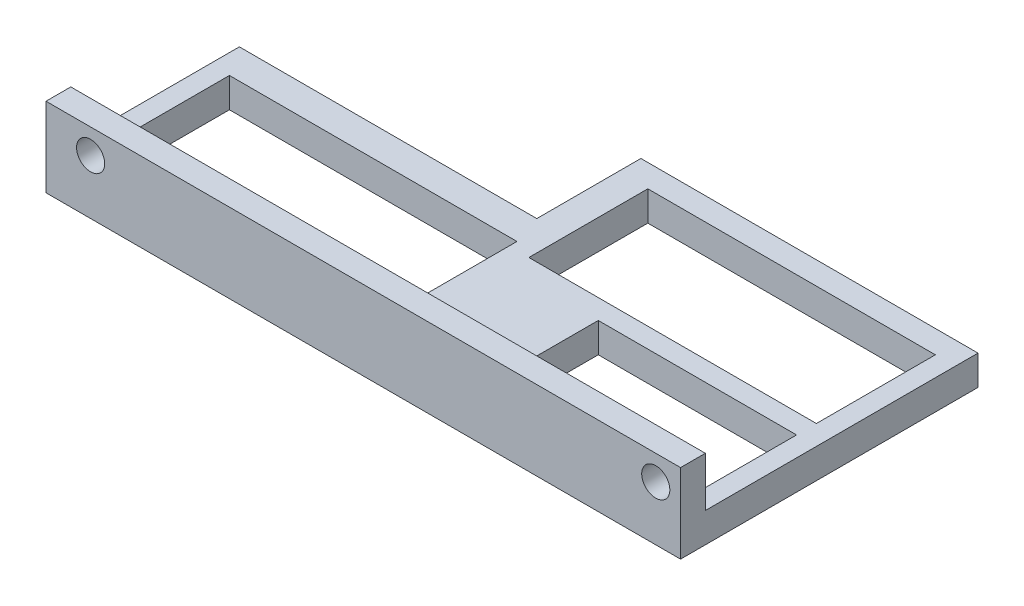
ISO-10303-21;
HEADER;
FILE_DESCRIPTION(('STEP AP214'),'2;1');
FILE_NAME('part.step','',(''),(''),'','','');
FILE_SCHEMA(('AUTOMOTIVE_DESIGN { 1 0 10303 214 1 1 1 1 }'));
ENDSEC;
DATA;
#1=APPLICATION_CONTEXT('core data for automotive mechanical design processes');
#2=APPLICATION_PROTOCOL_DEFINITION('international standard','automotive_design',2000,#1);
#3=PRODUCT_CONTEXT('',#1,'mechanical');
#4=PRODUCT('Part','Part','',(#3));
#5=PRODUCT_RELATED_PRODUCT_CATEGORY('part','',(#4));
#6=PRODUCT_DEFINITION_FORMATION('','',#4);
#7=PRODUCT_DEFINITION_CONTEXT('part definition',#1,'design');
#8=PRODUCT_DEFINITION('design','',#6,#7);
#9=PRODUCT_DEFINITION_SHAPE('','',#8);
#10=(LENGTH_UNIT() NAMED_UNIT(*) SI_UNIT(.MILLI.,.METRE.));
#11=(NAMED_UNIT(*) PLANE_ANGLE_UNIT() SI_UNIT($,.RADIAN.));
#12=(NAMED_UNIT(*) SI_UNIT($,.STERADIAN.) SOLID_ANGLE_UNIT());
#13=UNCERTAINTY_MEASURE_WITH_UNIT(LENGTH_MEASURE(1.E-05),#10,'distance_accuracy_value','');
#14=(GEOMETRIC_REPRESENTATION_CONTEXT(3) GLOBAL_UNCERTAINTY_ASSIGNED_CONTEXT((#13)) GLOBAL_UNIT_ASSIGNED_CONTEXT((#10,
#11,#12)) REPRESENTATION_CONTEXT('',''));
#15=CARTESIAN_POINT('',(0.,0.,0.));
#16=DIRECTION('',(0.,0.,1.));
#17=DIRECTION('',(1.,0.,0.));
#18=AXIS2_PLACEMENT_3D('',#15,#16,#17);
#19=CARTESIAN_POINT('',(0.,3.,0.));
#20=DIRECTION('',(0.,-1.,0.));
#21=DIRECTION('',(0.,0.,-1.));
#22=AXIS2_PLACEMENT_3D('',#19,#20,#21);
#23=PLANE('',#22);
#24=DIRECTION('',(1.,0.,0.));
#25=VECTOR('',#24,1.);
#26=CARTESIAN_POINT('',(1.99999999999999,3.,-4.));
#27=LINE('',#26,#25);
#28=CARTESIAN_POINT('',(1.99999999999999,3.,-4.));
#29=VERTEX_POINT('',#28);
#30=CARTESIAN_POINT('',(31.,3.,-4.));
#31=VERTEX_POINT('',#30);
#32=EDGE_CURVE('E297',#29,#31,#27,.T.);
#33=ORIENTED_EDGE('',*,*,#32,.F.);
#34=DIRECTION('',(0.,0.,1.));
#35=VECTOR('',#34,1.);
#36=CARTESIAN_POINT('',(1.99999999999998,3.,-16.5));
#37=LINE('',#36,#35);
#38=CARTESIAN_POINT('',(1.99999999999998,3.,-16.5));
#39=VERTEX_POINT('',#38);
#40=EDGE_CURVE('E295',#39,#29,#37,.T.);
#41=ORIENTED_EDGE('',*,*,#40,.F.);
#42=DIRECTION('',(-1.,0.,0.));
#43=VECTOR('',#42,1.);
#44=CARTESIAN_POINT('',(1.99999999999998,3.,-16.5));
#45=LINE('',#44,#43);
#46=CARTESIAN_POINT('',(31.,3.,-16.5));
#47=VERTEX_POINT('',#46);
#48=EDGE_CURVE('E303',#47,#39,#45,.T.);
#49=ORIENTED_EDGE('',*,*,#48,.F.);
#50=DIRECTION('',(0.,0.,-1.));
#51=VECTOR('',#50,1.);
#52=CARTESIAN_POINT('',(31.,3.,-4.));
#53=LINE('',#52,#51);
#54=EDGE_CURVE('E300',#31,#47,#53,.T.);
#55=ORIENTED_EDGE('',*,*,#54,.F.);
#56=EDGE_LOOP('',(#33,#41,#49,#55));
#57=FACE_BOUND('',#56,.T.);
#58=DIRECTION('',(1.,0.,0.));
#59=VECTOR('',#58,1.);
#60=CARTESIAN_POINT('',(33.,3.,-15.7));
#61=LINE('',#60,#59);
#62=CARTESIAN_POINT('',(33.,3.,-15.7));
#63=VERTEX_POINT('',#62);
#64=CARTESIAN_POINT('',(62.,3.,-15.7));
#65=VERTEX_POINT('',#64);
#66=EDGE_CURVE('E219',#63,#65,#61,.T.);
#67=ORIENTED_EDGE('',*,*,#66,.F.);
#68=DIRECTION('',(0.,0.,1.));
#69=VECTOR('',#68,1.);
#70=CARTESIAN_POINT('',(33.,3.,-15.7));
#71=LINE('',#70,#69);
#72=CARTESIAN_POINT('',(33.,3.,-27.7));
#73=VERTEX_POINT('',#72);
#74=EDGE_CURVE('E217',#73,#63,#71,.T.);
#75=ORIENTED_EDGE('',*,*,#74,.F.);
#76=DIRECTION('',(-1.,0.,0.));
#77=VECTOR('',#76,1.);
#78=CARTESIAN_POINT('',(33.,3.,-27.7));
#79=LINE('',#78,#77);
#80=CARTESIAN_POINT('',(62.,3.,-27.7));
#81=VERTEX_POINT('',#80);
#82=EDGE_CURVE('E225',#81,#73,#79,.T.);
#83=ORIENTED_EDGE('',*,*,#82,.F.);
#84=DIRECTION('',(0.,0.,-1.));
#85=VECTOR('',#84,1.);
#86=CARTESIAN_POINT('',(62.,3.,-27.7));
#87=LINE('',#86,#85);
#88=EDGE_CURVE('E222',#65,#81,#87,.T.);
#89=ORIENTED_EDGE('',*,*,#88,.F.);
#90=EDGE_LOOP('',(#67,#75,#83,#89));
#91=FACE_BOUND('',#90,.T.);
#92=DIRECTION('',(1.,0.,0.));
#93=VECTOR('',#92,1.);
#94=CARTESIAN_POINT('',(42.,3.,-4.));
#95=LINE('',#94,#93);
#96=CARTESIAN_POINT('',(42.,3.,-4.));
#97=VERTEX_POINT('',#96);
#98=CARTESIAN_POINT('',(62.,3.,-4.));
#99=VERTEX_POINT('',#98);
#100=EDGE_CURVE('E252',#97,#99,#95,.T.);
#101=ORIENTED_EDGE('',*,*,#100,.F.);
#102=DIRECTION('',(0.,0.,1.));
#103=VECTOR('',#102,1.);
#104=CARTESIAN_POINT('',(42.,3.,-13.7));
#105=LINE('',#104,#103);
#106=CARTESIAN_POINT('',(42.,3.,-13.7));
#107=VERTEX_POINT('',#106);
#108=EDGE_CURVE('E56',#107,#97,#105,.T.);
#109=ORIENTED_EDGE('',*,*,#108,.F.);
#110=DIRECTION('',(-1.,0.,0.));
#111=VECTOR('',#110,1.);
#112=CARTESIAN_POINT('',(42.,3.,-13.7));
#113=LINE('',#112,#111);
#114=CARTESIAN_POINT('',(62.,3.,-13.7));
#115=VERTEX_POINT('',#114);
#116=EDGE_CURVE('E258',#115,#107,#113,.T.);
#117=ORIENTED_EDGE('',*,*,#116,.F.);
#118=DIRECTION('',(0.,0.,-1.));
#119=VECTOR('',#118,1.);
#120=CARTESIAN_POINT('',(62.,3.,-13.7));
#121=LINE('',#120,#119);
#122=EDGE_CURVE('E255',#99,#115,#121,.T.);
#123=ORIENTED_EDGE('',*,*,#122,.F.);
#124=EDGE_LOOP('',(#101,#109,#117,#123));
#125=FACE_BOUND('',#124,.T.);
#126=DIRECTION('',(-1.,0.,0.));
#127=VECTOR('',#126,1.);
#128=CARTESIAN_POINT('',(0.,3.,-2.5));
#129=LINE('',#128,#127);
#130=CARTESIAN_POINT('',(64.,3.,-2.5));
#131=VERTEX_POINT('',#130);
#132=CARTESIAN_POINT('',(0.,3.,-2.5));
#133=VERTEX_POINT('',#132);
#134=EDGE_CURVE('E48',#131,#133,#129,.T.);
#135=ORIENTED_EDGE('',*,*,#134,.F.);
#136=DIRECTION('',(0.,0.,-1.));
#137=VECTOR('',#136,1.);
#138=CARTESIAN_POINT('',(64.,3.,0.));
#139=LINE('',#138,#137);
#140=CARTESIAN_POINT('',(64.,3.,-30.));
#141=VERTEX_POINT('',#140);
#142=EDGE_CURVE('E320',#131,#141,#139,.T.);
#143=ORIENTED_EDGE('',*,*,#142,.T.);
#144=DIRECTION('',(-1.,0.,0.));
#145=VECTOR('',#144,1.);
#146=CARTESIAN_POINT('',(0.,3.,-30.));
#147=LINE('',#146,#145);
#148=CARTESIAN_POINT('',(30.,3.,-30.));
#149=VERTEX_POINT('',#148);
#150=EDGE_CURVE('E323',#141,#149,#147,.T.);
#151=ORIENTED_EDGE('',*,*,#150,.T.);
#152=DIRECTION('',(0.,0.,-1.));
#153=VECTOR('',#152,1.);
#154=CARTESIAN_POINT('',(30.,3.,-30.));
#155=LINE('',#154,#153);
#156=CARTESIAN_POINT('',(30.,3.,-19.5));
#157=VERTEX_POINT('',#156);
#158=EDGE_CURVE('E276',#157,#149,#155,.T.);
#159=ORIENTED_EDGE('',*,*,#158,.F.);
#160=DIRECTION('',(1.,0.,0.));
#161=VECTOR('',#160,1.);
#162=CARTESIAN_POINT('',(0.,3.,-19.5));
#163=LINE('',#162,#161);
#164=CARTESIAN_POINT('',(0.,3.,-19.5));
#165=VERTEX_POINT('',#164);
#166=EDGE_CURVE('E273',#165,#157,#163,.T.);
#167=ORIENTED_EDGE('',*,*,#166,.F.);
#168=DIRECTION('',(0.,0.,1.));
#169=VECTOR('',#168,1.);
#170=CARTESIAN_POINT('',(0.,3.,0.));
#171=LINE('',#170,#169);
#172=EDGE_CURVE('E318',#165,#133,#171,.T.);
#173=ORIENTED_EDGE('',*,*,#172,.T.);
#174=EDGE_LOOP('',(#135,#143,#151,#159,#167,#173));
#175=FACE_BOUND('',#174,.T.);
#176=ADVANCED_FACE('F33',(#57,#91,#125,#175),#23,.F.);
#177=CARTESIAN_POINT('',(0.,3.,0.));
#178=DIRECTION('',(1.,0.,0.));
#179=DIRECTION('',(0.,0.,-1.));
#180=AXIS2_PLACEMENT_3D('',#177,#178,#179);
#181=PLANE('',#180);
#182=ORIENTED_EDGE('',*,*,#172,.F.);
#183=DIRECTION('',(0.,1.,0.));
#184=VECTOR('',#183,1.);
#185=CARTESIAN_POINT('',(0.,-0.00100000000000013,-19.5));
#186=LINE('',#185,#184);
#187=CARTESIAN_POINT('',(0.,0.,-19.5));
#188=VERTEX_POINT('',#187);
#189=EDGE_CURVE('E278',#188,#165,#186,.T.);
#190=ORIENTED_EDGE('',*,*,#189,.F.);
#191=DIRECTION('',(0.,0.,1.));
#192=VECTOR('',#191,1.);
#193=CARTESIAN_POINT('',(0.,0.,0.));
#194=LINE('',#193,#192);
#195=CARTESIAN_POINT('',(0.,0.,0.));
#196=VERTEX_POINT('',#195);
#197=EDGE_CURVE('E177',#188,#196,#194,.T.);
#198=ORIENTED_EDGE('',*,*,#197,.T.);
#199=DIRECTION('',(0.,-1.,0.));
#200=VECTOR('',#199,1.);
#201=CARTESIAN_POINT('',(0.,3.,0.));
#202=LINE('',#201,#200);
#203=CARTESIAN_POINT('',(0.,8.,0.));
#204=VERTEX_POINT('',#203);
#205=EDGE_CURVE('E11',#204,#196,#202,.T.);
#206=ORIENTED_EDGE('',*,*,#205,.F.);
#207=DIRECTION('',(0.,0.,1.));
#208=VECTOR('',#207,1.);
#209=CARTESIAN_POINT('',(0.,8.,-2.5));
#210=LINE('',#209,#208);
#211=CARTESIAN_POINT('',(0.,8.,-2.5));
#212=VERTEX_POINT('',#211);
#213=EDGE_CURVE('E174',#212,#204,#210,.T.);
#214=ORIENTED_EDGE('',*,*,#213,.F.);
#215=DIRECTION('',(0.,-1.,0.));
#216=VECTOR('',#215,1.);
#217=CARTESIAN_POINT('',(0.,8.,-2.5));
#218=LINE('',#217,#216);
#219=EDGE_CURVE('E200',#212,#133,#218,.T.);
#220=ORIENTED_EDGE('',*,*,#219,.T.);
#221=EDGE_LOOP('',(#182,#190,#198,#206,#214,#220));
#222=FACE_BOUND('',#221,.T.);
#223=ADVANCED_FACE('F35',(#222),#181,.F.);
#224=CARTESIAN_POINT('',(0.,3.,0.));
#225=DIRECTION('',(0.,0.,-1.));
#226=DIRECTION('',(-1.,0.,0.));
#227=AXIS2_PLACEMENT_3D('',#224,#225,#226);
#228=PLANE('',#227);
#229=CARTESIAN_POINT('',(61.5,5.5,0.));
#230=DIRECTION('',(0.,0.,1.));
#231=DIRECTION('',(1.,0.,0.));
#232=AXIS2_PLACEMENT_3D('',#229,#230,#231);
#233=CIRCLE('',#232,1.41917659701633);
#234=CARTESIAN_POINT('',(62.9191765970163,5.5,0.));
#235=VERTEX_POINT('',#234);
#236=EDGE_CURVE('E392',#235,#235,#233,.T.);
#237=ORIENTED_EDGE('',*,*,#236,.F.);
#238=EDGE_LOOP('',(#237));
#239=FACE_BOUND('',#238,.T.);
#240=CARTESIAN_POINT('',(4.49999999999999,5.5,0.));
#241=DIRECTION('',(0.,0.,1.));
#242=DIRECTION('',(1.,0.,0.));
#243=AXIS2_PLACEMENT_3D('',#240,#241,#242);
#244=CIRCLE('',#243,1.41917659701634);
#245=CARTESIAN_POINT('',(5.91917659701633,5.5,0.));
#246=VERTEX_POINT('',#245);
#247=EDGE_CURVE('E395',#246,#246,#244,.T.);
#248=ORIENTED_EDGE('',*,*,#247,.F.);
#249=EDGE_LOOP('',(#248));
#250=FACE_BOUND('',#249,.T.);
#251=DIRECTION('',(1.,0.,0.));
#252=VECTOR('',#251,1.);
#253=CARTESIAN_POINT('',(0.,0.,0.));
#254=LINE('',#253,#252);
#255=CARTESIAN_POINT('',(64.,0.,0.));
#256=VERTEX_POINT('',#255);
#257=EDGE_CURVE('E328',#196,#256,#254,.T.);
#258=ORIENTED_EDGE('',*,*,#257,.T.);
#259=DIRECTION('',(0.,-1.,0.));
#260=VECTOR('',#259,1.);
#261=CARTESIAN_POINT('',(64.,3.,0.));
#262=LINE('',#261,#260);
#263=CARTESIAN_POINT('',(64.,8.,0.));
#264=VERTEX_POINT('',#263);
#265=EDGE_CURVE('E41',#264,#256,#262,.T.);
#266=ORIENTED_EDGE('',*,*,#265,.F.);
#267=DIRECTION('',(1.,0.,0.));
#268=VECTOR('',#267,1.);
#269=CARTESIAN_POINT('',(0.,8.,0.));
#270=LINE('',#269,#268);
#271=EDGE_CURVE('E181',#204,#264,#270,.T.);
#272=ORIENTED_EDGE('',*,*,#271,.F.);
#273=ORIENTED_EDGE('',*,*,#205,.T.);
#274=EDGE_LOOP('',(#258,#266,#272,#273));
#275=FACE_BOUND('',#274,.T.);
#276=ADVANCED_FACE('F182',(#239,#250,#275),#228,.F.);
#277=CARTESIAN_POINT('',(64.,3.,0.));
#278=DIRECTION('',(-1.,0.,0.));
#279=DIRECTION('',(0.,0.,1.));
#280=AXIS2_PLACEMENT_3D('',#277,#278,#279);
#281=PLANE('',#280);
#282=DIRECTION('',(0.,0.,-1.));
#283=VECTOR('',#282,1.);
#284=CARTESIAN_POINT('',(64.,0.,0.));
#285=LINE('',#284,#283);
#286=CARTESIAN_POINT('',(64.,0.,-30.));
#287=VERTEX_POINT('',#286);
#288=EDGE_CURVE('E330',#256,#287,#285,.T.);
#289=ORIENTED_EDGE('',*,*,#288,.T.);
#290=DIRECTION('',(0.,-1.,0.));
#291=VECTOR('',#290,1.);
#292=CARTESIAN_POINT('',(64.,3.,-30.));
#293=LINE('',#292,#291);
#294=EDGE_CURVE('E326',#141,#287,#293,.T.);
#295=ORIENTED_EDGE('',*,*,#294,.F.);
#296=ORIENTED_EDGE('',*,*,#142,.F.);
#297=DIRECTION('',(0.,-1.,0.));
#298=VECTOR('',#297,1.);
#299=CARTESIAN_POINT('',(64.,8.,-2.5));
#300=LINE('',#299,#298);
#301=CARTESIAN_POINT('',(64.,8.,-2.5));
#302=VERTEX_POINT('',#301);
#303=EDGE_CURVE('E203',#302,#131,#300,.T.);
#304=ORIENTED_EDGE('',*,*,#303,.F.);
#305=DIRECTION('',(0.,0.,-1.));
#306=VECTOR('',#305,1.);
#307=CARTESIAN_POINT('',(64.,8.,-2.5));
#308=LINE('',#307,#306);
#309=EDGE_CURVE('E186',#264,#302,#308,.T.);
#310=ORIENTED_EDGE('',*,*,#309,.F.);
#311=ORIENTED_EDGE('',*,*,#265,.T.);
#312=EDGE_LOOP('',(#289,#295,#296,#304,#310,#311));
#313=FACE_BOUND('',#312,.T.);
#314=ADVANCED_FACE('F337',(#313),#281,.F.);
#315=CARTESIAN_POINT('',(0.,3.,-30.));
#316=DIRECTION('',(0.,0.,1.));
#317=DIRECTION('',(1.,0.,0.));
#318=AXIS2_PLACEMENT_3D('',#315,#316,#317);
#319=PLANE('',#318);
#320=DIRECTION('',(-1.,0.,0.));
#321=VECTOR('',#320,1.);
#322=CARTESIAN_POINT('',(0.,0.,-30.));
#323=LINE('',#322,#321);
#324=CARTESIAN_POINT('',(30.,0.,-30.));
#325=VERTEX_POINT('',#324);
#326=EDGE_CURVE('E321',#287,#325,#323,.T.);
#327=ORIENTED_EDGE('',*,*,#326,.T.);
#328=DIRECTION('',(0.,1.,0.));
#329=VECTOR('',#328,1.);
#330=CARTESIAN_POINT('',(30.,-0.00100000000000013,-30.));
#331=LINE('',#330,#329);
#332=EDGE_CURVE('E279',#325,#149,#331,.T.);
#333=ORIENTED_EDGE('',*,*,#332,.T.);
#334=ORIENTED_EDGE('',*,*,#150,.F.);
#335=ORIENTED_EDGE('',*,*,#294,.T.);
#336=EDGE_LOOP('',(#327,#333,#334,#335));
#337=FACE_BOUND('',#336,.T.);
#338=ADVANCED_FACE('F346',(#337),#319,.F.);
#339=CARTESIAN_POINT('',(0.,0.,0.));
#340=DIRECTION('',(0.,-1.,0.));
#341=DIRECTION('',(0.,0.,-1.));
#342=AXIS2_PLACEMENT_3D('',#339,#340,#341);
#343=PLANE('',#342);
#344=DIRECTION('',(0.,0.,-1.));
#345=VECTOR('',#344,1.);
#346=CARTESIAN_POINT('',(30.,0.,-30.));
#347=LINE('',#346,#345);
#348=CARTESIAN_POINT('',(30.,0.,-19.5));
#349=VERTEX_POINT('',#348);
#350=EDGE_CURVE('E206',#349,#325,#347,.T.);
#351=ORIENTED_EDGE('',*,*,#350,.T.);
#352=ORIENTED_EDGE('',*,*,#326,.F.);
#353=ORIENTED_EDGE('',*,*,#288,.F.);
#354=ORIENTED_EDGE('',*,*,#257,.F.);
#355=ORIENTED_EDGE('',*,*,#197,.F.);
#356=DIRECTION('',(1.,0.,0.));
#357=VECTOR('',#356,1.);
#358=CARTESIAN_POINT('',(0.,0.,-19.5));
#359=LINE('',#358,#357);
#360=EDGE_CURVE('E245',#188,#349,#359,.T.);
#361=ORIENTED_EDGE('',*,*,#360,.T.);
#362=EDGE_LOOP('',(#351,#352,#353,#354,#355,#361));
#363=FACE_BOUND('',#362,.T.);
#364=DIRECTION('',(0.,0.,1.));
#365=VECTOR('',#364,1.);
#366=CARTESIAN_POINT('',(42.,0.,-13.7));
#367=LINE('',#366,#365);
#368=CARTESIAN_POINT('',(42.,0.,-13.7));
#369=VERTEX_POINT('',#368);
#370=CARTESIAN_POINT('',(42.,0.,-4.));
#371=VERTEX_POINT('',#370);
#372=EDGE_CURVE('E248',#369,#371,#367,.T.);
#373=ORIENTED_EDGE('',*,*,#372,.T.);
#374=DIRECTION('',(1.,0.,0.));
#375=VECTOR('',#374,1.);
#376=CARTESIAN_POINT('',(42.,0.,-4.));
#377=LINE('',#376,#375);
#378=CARTESIAN_POINT('',(62.,0.,-4.));
#379=VERTEX_POINT('',#378);
#380=EDGE_CURVE('E211',#371,#379,#377,.T.);
#381=ORIENTED_EDGE('',*,*,#380,.T.);
#382=DIRECTION('',(0.,0.,-1.));
#383=VECTOR('',#382,1.);
#384=CARTESIAN_POINT('',(62.,0.,-13.7));
#385=LINE('',#384,#383);
#386=CARTESIAN_POINT('',(62.,0.,-13.7));
#387=VERTEX_POINT('',#386);
#388=EDGE_CURVE('E241',#379,#387,#385,.T.);
#389=ORIENTED_EDGE('',*,*,#388,.T.);
#390=DIRECTION('',(-1.,0.,0.));
#391=VECTOR('',#390,1.);
#392=CARTESIAN_POINT('',(42.,0.,-13.7));
#393=LINE('',#392,#391);
#394=EDGE_CURVE('E244',#387,#369,#393,.T.);
#395=ORIENTED_EDGE('',*,*,#394,.T.);
#396=EDGE_LOOP('',(#373,#381,#389,#395));
#397=FACE_BOUND('',#396,.T.);
#398=DIRECTION('',(0.,0.,1.));
#399=VECTOR('',#398,1.);
#400=CARTESIAN_POINT('',(33.,0.,-15.7));
#401=LINE('',#400,#399);
#402=CARTESIAN_POINT('',(33.,0.,-27.7));
#403=VERTEX_POINT('',#402);
#404=CARTESIAN_POINT('',(33.,0.,-15.7));
#405=VERTEX_POINT('',#404);
#406=EDGE_CURVE('E214',#403,#405,#401,.T.);
#407=ORIENTED_EDGE('',*,*,#406,.T.);
#408=DIRECTION('',(1.,0.,0.));
#409=VECTOR('',#408,1.);
#410=CARTESIAN_POINT('',(33.,0.,-15.7));
#411=LINE('',#410,#409);
#412=CARTESIAN_POINT('',(62.,0.,-15.7));
#413=VERTEX_POINT('',#412);
#414=EDGE_CURVE('E231',#405,#413,#411,.T.);
#415=ORIENTED_EDGE('',*,*,#414,.T.);
#416=DIRECTION('',(0.,0.,-1.));
#417=VECTOR('',#416,1.);
#418=CARTESIAN_POINT('',(62.,0.,-27.7));
#419=LINE('',#418,#417);
#420=CARTESIAN_POINT('',(62.,0.,-27.7));
#421=VERTEX_POINT('',#420);
#422=EDGE_CURVE('E207',#413,#421,#419,.T.);
#423=ORIENTED_EDGE('',*,*,#422,.T.);
#424=DIRECTION('',(-1.,0.,0.));
#425=VECTOR('',#424,1.);
#426=CARTESIAN_POINT('',(33.,0.,-27.7));
#427=LINE('',#426,#425);
#428=EDGE_CURVE('E210',#421,#403,#427,.T.);
#429=ORIENTED_EDGE('',*,*,#428,.T.);
#430=EDGE_LOOP('',(#407,#415,#423,#429));
#431=FACE_BOUND('',#430,.T.);
#432=DIRECTION('',(0.,0.,1.));
#433=VECTOR('',#432,1.);
#434=CARTESIAN_POINT('',(1.99999999999998,0.,-16.5));
#435=LINE('',#434,#433);
#436=CARTESIAN_POINT('',(1.99999999999998,0.,-16.5));
#437=VERTEX_POINT('',#436);
#438=CARTESIAN_POINT('',(1.99999999999999,0.,-4.));
#439=VERTEX_POINT('',#438);
#440=EDGE_CURVE('E292',#437,#439,#435,.T.);
#441=ORIENTED_EDGE('',*,*,#440,.T.);
#442=DIRECTION('',(1.,0.,0.));
#443=VECTOR('',#442,1.);
#444=CARTESIAN_POINT('',(1.99999999999999,0.,-4.));
#445=LINE('',#444,#443);
#446=CARTESIAN_POINT('',(31.,0.,-4.));
#447=VERTEX_POINT('',#446);
#448=EDGE_CURVE('E309',#439,#447,#445,.T.);
#449=ORIENTED_EDGE('',*,*,#448,.T.);
#450=DIRECTION('',(0.,0.,-1.));
#451=VECTOR('',#450,1.);
#452=CARTESIAN_POINT('',(31.,0.,-4.));
#453=LINE('',#452,#451);
#454=CARTESIAN_POINT('',(31.,0.,-16.5));
#455=VERTEX_POINT('',#454);
#456=EDGE_CURVE('E240',#447,#455,#453,.T.);
#457=ORIENTED_EDGE('',*,*,#456,.T.);
#458=DIRECTION('',(-1.,0.,0.));
#459=VECTOR('',#458,1.);
#460=CARTESIAN_POINT('',(1.99999999999998,0.,-16.5));
#461=LINE('',#460,#459);
#462=EDGE_CURVE('E289',#455,#437,#461,.T.);
#463=ORIENTED_EDGE('',*,*,#462,.T.);
#464=EDGE_LOOP('',(#441,#449,#457,#463));
#465=FACE_BOUND('',#464,.T.);
#466=ADVANCED_FACE('F342',(#363,#397,#431,#465),#343,.T.);
#467=CARTESIAN_POINT('',(1.99999999999998,-0.00100000000000013,-16.5));
#468=DIRECTION('',(-1.,0.,0.));
#469=DIRECTION('',(0.,0.,1.));
#470=AXIS2_PLACEMENT_3D('',#467,#468,#469);
#471=PLANE('',#470);
#472=DIRECTION('',(0.,1.,0.));
#473=VECTOR('',#472,1.);
#474=CARTESIAN_POINT('',(1.99999999999998,-0.00100000000000013,-16.5));
#475=LINE('',#474,#473);
#476=EDGE_CURVE('E307',#437,#39,#475,.T.);
#477=ORIENTED_EDGE('',*,*,#476,.T.);
#478=ORIENTED_EDGE('',*,*,#40,.T.);
#479=DIRECTION('',(0.,1.,0.));
#480=VECTOR('',#479,1.);
#481=CARTESIAN_POINT('',(1.99999999999999,-0.00100000000000013,-4.));
#482=LINE('',#481,#480);
#483=EDGE_CURVE('E306',#439,#29,#482,.T.);
#484=ORIENTED_EDGE('',*,*,#483,.F.);
#485=ORIENTED_EDGE('',*,*,#440,.F.);
#486=EDGE_LOOP('',(#477,#478,#484,#485));
#487=FACE_BOUND('',#486,.T.);
#488=ADVANCED_FACE('F378',(#487),#471,.F.);
#489=CARTESIAN_POINT('',(1.99999999999998,-0.00100000000000013,-16.5));
#490=DIRECTION('',(0.,0.,-1.));
#491=DIRECTION('',(-1.,0.,0.));
#492=AXIS2_PLACEMENT_3D('',#489,#490,#491);
#493=PLANE('',#492);
#494=DIRECTION('',(0.,1.,0.));
#495=VECTOR('',#494,1.);
#496=CARTESIAN_POINT('',(31.,-0.00100000000000013,-16.5));
#497=LINE('',#496,#495);
#498=EDGE_CURVE('E310',#455,#47,#497,.T.);
#499=ORIENTED_EDGE('',*,*,#498,.T.);
#500=ORIENTED_EDGE('',*,*,#48,.T.);
#501=ORIENTED_EDGE('',*,*,#476,.F.);
#502=ORIENTED_EDGE('',*,*,#462,.F.);
#503=EDGE_LOOP('',(#499,#500,#501,#502));
#504=FACE_BOUND('',#503,.T.);
#505=ADVANCED_FACE('F461',(#504),#493,.F.);
#506=CARTESIAN_POINT('',(31.,-0.00100000000000013,-4.));
#507=DIRECTION('',(1.,0.,0.));
#508=DIRECTION('',(0.,0.,-1.));
#509=AXIS2_PLACEMENT_3D('',#506,#507,#508);
#510=PLANE('',#509);
#511=DIRECTION('',(0.,1.,0.));
#512=VECTOR('',#511,1.);
#513=CARTESIAN_POINT('',(31.,-0.00100000000000013,-4.));
#514=LINE('',#513,#512);
#515=EDGE_CURVE('E312',#447,#31,#514,.T.);
#516=ORIENTED_EDGE('',*,*,#515,.T.);
#517=ORIENTED_EDGE('',*,*,#54,.T.);
#518=ORIENTED_EDGE('',*,*,#498,.F.);
#519=ORIENTED_EDGE('',*,*,#456,.F.);
#520=EDGE_LOOP('',(#516,#517,#518,#519));
#521=FACE_BOUND('',#520,.T.);
#522=ADVANCED_FACE('F469',(#521),#510,.F.);
#523=CARTESIAN_POINT('',(1.99999999999999,-0.00100000000000013,-4.));
#524=DIRECTION('',(0.,0.,1.));
#525=DIRECTION('',(1.,0.,0.));
#526=AXIS2_PLACEMENT_3D('',#523,#524,#525);
#527=PLANE('',#526);
#528=ORIENTED_EDGE('',*,*,#483,.T.);
#529=ORIENTED_EDGE('',*,*,#32,.T.);
#530=ORIENTED_EDGE('',*,*,#515,.F.);
#531=ORIENTED_EDGE('',*,*,#448,.F.);
#532=EDGE_LOOP('',(#528,#529,#530,#531));
#533=FACE_BOUND('',#532,.T.);
#534=ADVANCED_FACE('F437',(#533),#527,.F.);
#535=CARTESIAN_POINT('',(33.,-0.00100000000000013,-15.7));
#536=DIRECTION('',(-1.,0.,0.));
#537=DIRECTION('',(0.,0.,1.));
#538=AXIS2_PLACEMENT_3D('',#535,#536,#537);
#539=PLANE('',#538);
#540=DIRECTION('',(0.,1.,0.));
#541=VECTOR('',#540,1.);
#542=CARTESIAN_POINT('',(33.,-0.00100000000000013,-27.7));
#543=LINE('',#542,#541);
#544=EDGE_CURVE('E229',#403,#73,#543,.T.);
#545=ORIENTED_EDGE('',*,*,#544,.T.);
#546=ORIENTED_EDGE('',*,*,#74,.T.);
#547=DIRECTION('',(0.,1.,0.));
#548=VECTOR('',#547,1.);
#549=CARTESIAN_POINT('',(33.,-0.00100000000000013,-15.7));
#550=LINE('',#549,#548);
#551=EDGE_CURVE('E228',#405,#63,#550,.T.);
#552=ORIENTED_EDGE('',*,*,#551,.F.);
#553=ORIENTED_EDGE('',*,*,#406,.F.);
#554=EDGE_LOOP('',(#545,#546,#552,#553));
#555=FACE_BOUND('',#554,.T.);
#556=ADVANCED_FACE('F425',(#555),#539,.F.);
#557=CARTESIAN_POINT('',(33.,-0.00100000000000013,-27.7));
#558=DIRECTION('',(0.,0.,-1.));
#559=DIRECTION('',(-1.,0.,0.));
#560=AXIS2_PLACEMENT_3D('',#557,#558,#559);
#561=PLANE('',#560);
#562=DIRECTION('',(0.,1.,0.));
#563=VECTOR('',#562,1.);
#564=CARTESIAN_POINT('',(62.,-0.00100000000000013,-27.7));
#565=LINE('',#564,#563);
#566=EDGE_CURVE('E232',#421,#81,#565,.T.);
#567=ORIENTED_EDGE('',*,*,#566,.T.);
#568=ORIENTED_EDGE('',*,*,#82,.T.);
#569=ORIENTED_EDGE('',*,*,#544,.F.);
#570=ORIENTED_EDGE('',*,*,#428,.F.);
#571=EDGE_LOOP('',(#567,#568,#569,#570));
#572=FACE_BOUND('',#571,.T.);
#573=ADVANCED_FACE('F421',(#572),#561,.F.);
#574=CARTESIAN_POINT('',(62.,-0.00100000000000013,-27.7));
#575=DIRECTION('',(1.,0.,0.));
#576=DIRECTION('',(0.,0.,-1.));
#577=AXIS2_PLACEMENT_3D('',#574,#575,#576);
#578=PLANE('',#577);
#579=DIRECTION('',(0.,1.,0.));
#580=VECTOR('',#579,1.);
#581=CARTESIAN_POINT('',(62.,-0.00100000000000013,-15.7));
#582=LINE('',#581,#580);
#583=EDGE_CURVE('E234',#413,#65,#582,.T.);
#584=ORIENTED_EDGE('',*,*,#583,.T.);
#585=ORIENTED_EDGE('',*,*,#88,.T.);
#586=ORIENTED_EDGE('',*,*,#566,.F.);
#587=ORIENTED_EDGE('',*,*,#422,.F.);
#588=EDGE_LOOP('',(#584,#585,#586,#587));
#589=FACE_BOUND('',#588,.T.);
#590=ADVANCED_FACE('F424',(#589),#578,.F.);
#591=CARTESIAN_POINT('',(33.,-0.00100000000000013,-15.7));
#592=DIRECTION('',(0.,0.,1.));
#593=DIRECTION('',(1.,0.,0.));
#594=AXIS2_PLACEMENT_3D('',#591,#592,#593);
#595=PLANE('',#594);
#596=ORIENTED_EDGE('',*,*,#551,.T.);
#597=ORIENTED_EDGE('',*,*,#66,.T.);
#598=ORIENTED_EDGE('',*,*,#583,.F.);
#599=ORIENTED_EDGE('',*,*,#414,.F.);
#600=EDGE_LOOP('',(#596,#597,#598,#599));
#601=FACE_BOUND('',#600,.T.);
#602=ADVANCED_FACE('F429',(#601),#595,.F.);
#603=CARTESIAN_POINT('',(42.,-0.00100000000000013,-13.7));
#604=DIRECTION('',(-1.,0.,0.));
#605=DIRECTION('',(0.,0.,1.));
#606=AXIS2_PLACEMENT_3D('',#603,#604,#605);
#607=PLANE('',#606);
#608=DIRECTION('',(0.,1.,0.));
#609=VECTOR('',#608,1.);
#610=CARTESIAN_POINT('',(42.,-0.00100000000000013,-13.7));
#611=LINE('',#610,#609);
#612=EDGE_CURVE('E262',#369,#107,#611,.T.);
#613=ORIENTED_EDGE('',*,*,#612,.T.);
#614=ORIENTED_EDGE('',*,*,#108,.T.);
#615=DIRECTION('',(0.,1.,0.));
#616=VECTOR('',#615,1.);
#617=CARTESIAN_POINT('',(42.,-0.00100000000000013,-4.));
#618=LINE('',#617,#616);
#619=EDGE_CURVE('E261',#371,#97,#618,.T.);
#620=ORIENTED_EDGE('',*,*,#619,.F.);
#621=ORIENTED_EDGE('',*,*,#372,.F.);
#622=EDGE_LOOP('',(#613,#614,#620,#621));
#623=FACE_BOUND('',#622,.T.);
#624=ADVANCED_FACE('F433',(#623),#607,.F.);
#625=CARTESIAN_POINT('',(42.,-0.00100000000000013,-13.7));
#626=DIRECTION('',(0.,0.,-1.));
#627=DIRECTION('',(-1.,0.,0.));
#628=AXIS2_PLACEMENT_3D('',#625,#626,#627);
#629=PLANE('',#628);
#630=DIRECTION('',(0.,1.,0.));
#631=VECTOR('',#630,1.);
#632=CARTESIAN_POINT('',(62.,-0.00100000000000013,-13.7));
#633=LINE('',#632,#631);
#634=EDGE_CURVE('E264',#387,#115,#633,.T.);
#635=ORIENTED_EDGE('',*,*,#634,.T.);
#636=ORIENTED_EDGE('',*,*,#116,.T.);
#637=ORIENTED_EDGE('',*,*,#612,.F.);
#638=ORIENTED_EDGE('',*,*,#394,.F.);
#639=EDGE_LOOP('',(#635,#636,#637,#638));
#640=FACE_BOUND('',#639,.T.);
#641=ADVANCED_FACE('F439',(#640),#629,.F.);
#642=CARTESIAN_POINT('',(62.,-0.00100000000000013,-13.7));
#643=DIRECTION('',(1.,0.,0.));
#644=DIRECTION('',(0.,0.,-1.));
#645=AXIS2_PLACEMENT_3D('',#642,#643,#644);
#646=PLANE('',#645);
#647=DIRECTION('',(0.,1.,0.));
#648=VECTOR('',#647,1.);
#649=CARTESIAN_POINT('',(62.,-0.00100000000000013,-4.));
#650=LINE('',#649,#648);
#651=EDGE_CURVE('E266',#379,#99,#650,.T.);
#652=ORIENTED_EDGE('',*,*,#651,.T.);
#653=ORIENTED_EDGE('',*,*,#122,.T.);
#654=ORIENTED_EDGE('',*,*,#634,.F.);
#655=ORIENTED_EDGE('',*,*,#388,.F.);
#656=EDGE_LOOP('',(#652,#653,#654,#655));
#657=FACE_BOUND('',#656,.T.);
#658=ADVANCED_FACE('F364',(#657),#646,.F.);
#659=CARTESIAN_POINT('',(42.,-0.00100000000000013,-4.));
#660=DIRECTION('',(0.,0.,1.));
#661=DIRECTION('',(1.,0.,0.));
#662=AXIS2_PLACEMENT_3D('',#659,#660,#661);
#663=PLANE('',#662);
#664=ORIENTED_EDGE('',*,*,#619,.T.);
#665=ORIENTED_EDGE('',*,*,#100,.T.);
#666=ORIENTED_EDGE('',*,*,#651,.F.);
#667=ORIENTED_EDGE('',*,*,#380,.F.);
#668=EDGE_LOOP('',(#664,#665,#666,#667));
#669=FACE_BOUND('',#668,.T.);
#670=ADVANCED_FACE('F357',(#669),#663,.F.);
#671=CARTESIAN_POINT('',(30.,-0.00100000000000013,-30.));
#672=DIRECTION('',(1.,0.,0.));
#673=DIRECTION('',(0.,0.,-1.));
#674=AXIS2_PLACEMENT_3D('',#671,#672,#673);
#675=PLANE('',#674);
#676=DIRECTION('',(0.,1.,0.));
#677=VECTOR('',#676,1.);
#678=CARTESIAN_POINT('',(30.,-0.00100000000000013,-19.5));
#679=LINE('',#678,#677);
#680=EDGE_CURVE('E282',#349,#157,#679,.T.);
#681=ORIENTED_EDGE('',*,*,#680,.T.);
#682=ORIENTED_EDGE('',*,*,#158,.T.);
#683=ORIENTED_EDGE('',*,*,#332,.F.);
#684=ORIENTED_EDGE('',*,*,#350,.F.);
#685=EDGE_LOOP('',(#681,#682,#683,#684));
#686=FACE_BOUND('',#685,.T.);
#687=ADVANCED_FACE('F355',(#686),#675,.F.);
#688=CARTESIAN_POINT('',(0.,-0.00100000000000013,-19.5));
#689=DIRECTION('',(0.,0.,1.));
#690=DIRECTION('',(1.,0.,0.));
#691=AXIS2_PLACEMENT_3D('',#688,#689,#690);
#692=PLANE('',#691);
#693=ORIENTED_EDGE('',*,*,#189,.T.);
#694=ORIENTED_EDGE('',*,*,#166,.T.);
#695=ORIENTED_EDGE('',*,*,#680,.F.);
#696=ORIENTED_EDGE('',*,*,#360,.F.);
#697=EDGE_LOOP('',(#693,#694,#695,#696));
#698=FACE_BOUND('',#697,.T.);
#699=ADVANCED_FACE('F353',(#698),#692,.F.);
#700=CARTESIAN_POINT('',(0.,8.,-2.5));
#701=DIRECTION('',(0.,0.,1.));
#702=DIRECTION('',(1.,0.,0.));
#703=AXIS2_PLACEMENT_3D('',#700,#701,#702);
#704=PLANE('',#703);
#705=CARTESIAN_POINT('',(61.5,5.5,-2.5));
#706=DIRECTION('',(0.,0.,1.));
#707=DIRECTION('',(1.,0.,0.));
#708=AXIS2_PLACEMENT_3D('',#705,#706,#707);
#709=CIRCLE('',#708,1.41917659701633);
#710=CARTESIAN_POINT('',(62.9191765970163,5.5,-2.5));
#711=VERTEX_POINT('',#710);
#712=EDGE_CURVE('E193',#711,#711,#709,.F.);
#713=ORIENTED_EDGE('',*,*,#712,.F.);
#714=EDGE_LOOP('',(#713));
#715=FACE_BOUND('',#714,.T.);
#716=CARTESIAN_POINT('',(4.49999999999999,5.5,-2.5));
#717=DIRECTION('',(0.,0.,1.));
#718=DIRECTION('',(1.,0.,0.));
#719=AXIS2_PLACEMENT_3D('',#716,#717,#718);
#720=CIRCLE('',#719,1.41917659701634);
#721=CARTESIAN_POINT('',(5.91917659701633,5.5,-2.5));
#722=VERTEX_POINT('',#721);
#723=EDGE_CURVE('E196',#722,#722,#720,.F.);
#724=ORIENTED_EDGE('',*,*,#723,.F.);
#725=EDGE_LOOP('',(#724));
#726=FACE_BOUND('',#725,.T.);
#727=ORIENTED_EDGE('',*,*,#134,.T.);
#728=ORIENTED_EDGE('',*,*,#219,.F.);
#729=DIRECTION('',(-1.,0.,0.));
#730=VECTOR('',#729,1.);
#731=CARTESIAN_POINT('',(0.,8.,-2.5));
#732=LINE('',#731,#730);
#733=EDGE_CURVE('E190',#302,#212,#732,.T.);
#734=ORIENTED_EDGE('',*,*,#733,.F.);
#735=ORIENTED_EDGE('',*,*,#303,.T.);
#736=EDGE_LOOP('',(#727,#728,#734,#735));
#737=FACE_BOUND('',#736,.T.);
#738=ADVANCED_FACE('F349',(#715,#726,#737),#704,.F.);
#739=CARTESIAN_POINT('',(0.,8.,0.));
#740=DIRECTION('',(0.,1.,0.));
#741=DIRECTION('',(0.,0.,1.));
#742=AXIS2_PLACEMENT_3D('',#739,#740,#741);
#743=PLANE('',#742);
#744=ORIENTED_EDGE('',*,*,#213,.T.);
#745=ORIENTED_EDGE('',*,*,#271,.T.);
#746=ORIENTED_EDGE('',*,*,#309,.T.);
#747=ORIENTED_EDGE('',*,*,#733,.T.);
#748=EDGE_LOOP('',(#744,#745,#746,#747));
#749=FACE_BOUND('',#748,.T.);
#750=ADVANCED_FACE('F188',(#749),#743,.T.);
#751=CARTESIAN_POINT('',(4.49999999999999,5.5,-30.001));
#752=DIRECTION('',(0.,0.,1.));
#753=DIRECTION('',(1.,0.,0.));
#754=AXIS2_PLACEMENT_3D('',#751,#752,#753);
#755=CYLINDRICAL_SURFACE('',#754,1.41917659701634);
#756=ORIENTED_EDGE('',*,*,#247,.T.);
#757=EDGE_LOOP('',(#756));
#758=FACE_BOUND('',#757,.T.);
#759=ORIENTED_EDGE('',*,*,#723,.T.);
#760=EDGE_LOOP('',(#759));
#761=FACE_BOUND('',#760,.T.);
#762=ADVANCED_FACE('F405',(#758,#761),#755,.F.);
#763=CARTESIAN_POINT('',(61.5,5.5,-30.001));
#764=DIRECTION('',(0.,0.,1.));
#765=DIRECTION('',(1.,0.,0.));
#766=AXIS2_PLACEMENT_3D('',#763,#764,#765);
#767=CYLINDRICAL_SURFACE('',#766,1.41917659701633);
#768=ORIENTED_EDGE('',*,*,#236,.T.);
#769=EDGE_LOOP('',(#768));
#770=FACE_BOUND('',#769,.T.);
#771=ORIENTED_EDGE('',*,*,#712,.T.);
#772=EDGE_LOOP('',(#771));
#773=FACE_BOUND('',#772,.T.);
#774=ADVANCED_FACE('F402',(#770,#773),#767,.F.);
#775=CLOSED_SHELL('',(#176,#223,#276,#314,#338,#466,#488,#505,#522,#534,#556,#573,#590,#602,
#624,#641,#658,#670,#687,#699,#738,#750,#762,#774));
#776=MANIFOLD_SOLID_BREP('B2',#775);
#777=ADVANCED_BREP_SHAPE_REPRESENTATION('',(#18,#776),#14);
#778=SHAPE_DEFINITION_REPRESENTATION(#9,#777);
ENDSEC;
END-ISO-10303-21;
